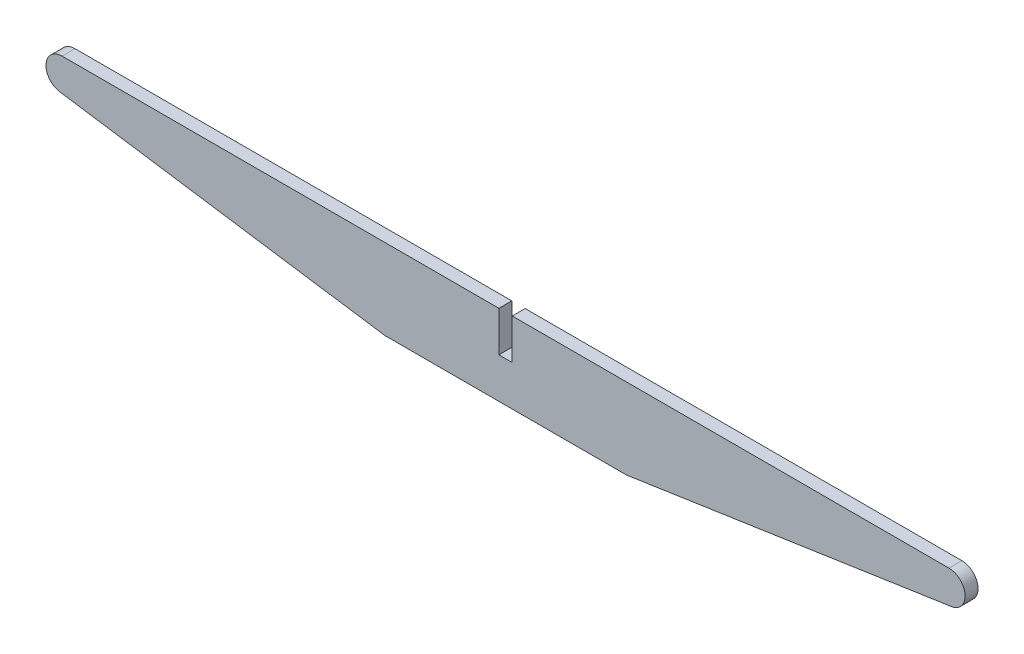
ISO-10303-21;
HEADER;
FILE_DESCRIPTION(('STEP AP214'),'2;1');
FILE_NAME('part.step','',(''),(''),'','','');
FILE_SCHEMA(('AUTOMOTIVE_DESIGN { 1 0 10303 214 1 1 1 1 }'));
ENDSEC;
DATA;
#1=APPLICATION_CONTEXT('core data for automotive mechanical design processes');
#2=APPLICATION_PROTOCOL_DEFINITION('international standard','automotive_design',2000,#1);
#3=PRODUCT_CONTEXT('',#1,'mechanical');
#4=PRODUCT('Part','Part','',(#3));
#5=PRODUCT_RELATED_PRODUCT_CATEGORY('part','',(#4));
#6=PRODUCT_DEFINITION_FORMATION('','',#4);
#7=PRODUCT_DEFINITION_CONTEXT('part definition',#1,'design');
#8=PRODUCT_DEFINITION('design','',#6,#7);
#9=PRODUCT_DEFINITION_SHAPE('','',#8);
#10=(LENGTH_UNIT() NAMED_UNIT(*) SI_UNIT(.MILLI.,.METRE.));
#11=(NAMED_UNIT(*) PLANE_ANGLE_UNIT() SI_UNIT($,.RADIAN.));
#12=(NAMED_UNIT(*) SI_UNIT($,.STERADIAN.) SOLID_ANGLE_UNIT());
#13=UNCERTAINTY_MEASURE_WITH_UNIT(LENGTH_MEASURE(1.E-05),#10,'distance_accuracy_value','');
#14=(GEOMETRIC_REPRESENTATION_CONTEXT(3) GLOBAL_UNCERTAINTY_ASSIGNED_CONTEXT((#13)) GLOBAL_UNIT_ASSIGNED_CONTEXT((#10,
#11,#12)) REPRESENTATION_CONTEXT('',''));
#15=CARTESIAN_POINT('',(0.,0.,0.));
#16=DIRECTION('',(0.,0.,1.));
#17=DIRECTION('',(1.,0.,0.));
#18=AXIS2_PLACEMENT_3D('',#15,#16,#17);
#19=CARTESIAN_POINT('',(-110.,0.,1.6));
#20=DIRECTION('',(0.,-1.,0.));
#21=DIRECTION('',(1.,0.,0.));
#22=AXIS2_PLACEMENT_3D('',#19,#20,#21);
#23=PLANE('',#22);
#24=DIRECTION('',(0.,0.,1.));
#25=VECTOR('',#24,1.);
#26=CARTESIAN_POINT('',(1.65,0.,-1.601));
#27=LINE('',#26,#25);
#28=CARTESIAN_POINT('',(1.65,0.,-1.6));
#29=VERTEX_POINT('',#28);
#30=CARTESIAN_POINT('',(1.65,0.,1.6));
#31=VERTEX_POINT('',#30);
#32=EDGE_CURVE('E169',#29,#31,#27,.T.);
#33=ORIENTED_EDGE('',*,*,#32,.T.);
#34=DIRECTION('',(-1.,0.,0.));
#35=VECTOR('',#34,1.);
#36=CARTESIAN_POINT('',(-110.,0.,1.6));
#37=LINE('',#36,#35);
#38=CARTESIAN_POINT('',(110.,0.,1.6));
#39=VERTEX_POINT('',#38);
#40=EDGE_CURVE('E92',#39,#31,#37,.T.);
#41=ORIENTED_EDGE('',*,*,#40,.F.);
#42=DIRECTION('',(0.,0.,-1.));
#43=VECTOR('',#42,1.);
#44=CARTESIAN_POINT('',(110.,0.,1.6));
#45=LINE('',#44,#43);
#46=CARTESIAN_POINT('',(110.,0.,-1.6));
#47=VERTEX_POINT('',#46);
#48=EDGE_CURVE('E11',#39,#47,#45,.T.);
#49=ORIENTED_EDGE('',*,*,#48,.T.);
#50=DIRECTION('',(-1.,0.,0.));
#51=VECTOR('',#50,1.);
#52=CARTESIAN_POINT('',(-110.,0.,-1.6));
#53=LINE('',#52,#51);
#54=EDGE_CURVE('E136',#47,#29,#53,.T.);
#55=ORIENTED_EDGE('',*,*,#54,.T.);
#56=EDGE_LOOP('',(#33,#41,#49,#55));
#57=FACE_BOUND('',#56,.T.);
#58=ADVANCED_FACE('F33',(#57),#23,.F.);
#59=CARTESIAN_POINT('',(110.,-4.,1.6));
#60=DIRECTION('',(0.,0.,-1.));
#61=DIRECTION('',(-1.,0.,0.));
#62=AXIS2_PLACEMENT_3D('',#59,#60,#61);
#63=PLANE('',#62);
#64=DIRECTION('',(0.,-1.,0.));
#65=VECTOR('',#64,1.);
#66=CARTESIAN_POINT('',(1.65,0.,1.6));
#67=LINE('',#66,#65);
#68=CARTESIAN_POINT('',(1.65,-10.,1.6));
#69=VERTEX_POINT('',#68);
#70=EDGE_CURVE('E175',#31,#69,#67,.T.);
#71=ORIENTED_EDGE('',*,*,#70,.T.);
#72=DIRECTION('',(1.,0.,0.));
#73=VECTOR('',#72,1.);
#74=CARTESIAN_POINT('',(0.,-10.,1.6));
#75=LINE('',#74,#73);
#76=CARTESIAN_POINT('',(-1.65,-10.,1.6));
#77=VERTEX_POINT('',#76);
#78=EDGE_CURVE('E201',#77,#69,#75,.T.);
#79=ORIENTED_EDGE('',*,*,#78,.F.);
#80=DIRECTION('',(0.,-1.,0.));
#81=VECTOR('',#80,1.);
#82=CARTESIAN_POINT('',(-1.65,0.,1.6));
#83=LINE('',#82,#81);
#84=CARTESIAN_POINT('',(-1.65,0.,1.6));
#85=VERTEX_POINT('',#84);
#86=EDGE_CURVE('E205',#85,#77,#83,.T.);
#87=ORIENTED_EDGE('',*,*,#86,.F.);
#88=CARTESIAN_POINT('',(-110.,0.,1.6));
#89=VERTEX_POINT('',#88);
#90=EDGE_CURVE('E165',#85,#89,#37,.T.);
#91=ORIENTED_EDGE('',*,*,#90,.T.);
#92=CARTESIAN_POINT('',(-110.,-4.00000000000003,1.6));
#93=DIRECTION('',(0.,0.,1.));
#94=DIRECTION('',(1.,0.,0.));
#95=AXIS2_PLACEMENT_3D('',#92,#93,#94);
#96=CIRCLE('',#95,4.00000000000001);
#97=CARTESIAN_POINT('',(-110.591213414902,-7.95606707451222,1.6));
#98=VERTEX_POINT('',#97);
#99=EDGE_CURVE('E110',#89,#98,#96,.T.);
#100=ORIENTED_EDGE('',*,*,#99,.T.);
#101=DIRECTION('',(0.989016768628046,-0.147803353725609,0.));
#102=VECTOR('',#101,1.);
#103=CARTESIAN_POINT('',(-110.591213414902,-7.95606707451221,1.6));
#104=LINE('',#103,#102);
#105=CARTESIAN_POINT('',(-30.,-20.,1.6));
#106=VERTEX_POINT('',#105);
#107=EDGE_CURVE('E102',#98,#106,#104,.T.);
#108=ORIENTED_EDGE('',*,*,#107,.T.);
#109=DIRECTION('',(1.,0.,0.));
#110=VECTOR('',#109,1.);
#111=CARTESIAN_POINT('',(-30.,-20.,1.6));
#112=LINE('',#111,#110);
#113=CARTESIAN_POINT('',(30.,-20.,1.6));
#114=VERTEX_POINT('',#113);
#115=EDGE_CURVE('E107',#106,#114,#112,.T.);
#116=ORIENTED_EDGE('',*,*,#115,.T.);
#117=DIRECTION('',(0.989016768628046,0.147803353725609,0.));
#118=VECTOR('',#117,1.);
#119=CARTESIAN_POINT('',(110.591213414902,-7.95606707451218,1.6));
#120=LINE('',#119,#118);
#121=CARTESIAN_POINT('',(110.591213414902,-7.95606707451218,1.6));
#122=VERTEX_POINT('',#121);
#123=EDGE_CURVE('E57',#114,#122,#120,.T.);
#124=ORIENTED_EDGE('',*,*,#123,.T.);
#125=CARTESIAN_POINT('',(110.,-4.,1.6));
#126=DIRECTION('',(0.,0.,1.));
#127=DIRECTION('',(-1.,0.,0.));
#128=AXIS2_PLACEMENT_3D('',#125,#126,#127);
#129=CIRCLE('',#128,4.00000000000001);
#130=EDGE_CURVE('E145',#122,#39,#129,.T.);
#131=ORIENTED_EDGE('',*,*,#130,.T.);
#132=ORIENTED_EDGE('',*,*,#40,.T.);
#133=EDGE_LOOP('',(#71,#79,#87,#91,#100,#108,#116,#124,#131,#132));
#134=FACE_BOUND('',#133,.T.);
#135=ADVANCED_FACE('F105',(#134),#63,.F.);
#136=CARTESIAN_POINT('',(110.,-4.,-1.6));
#137=DIRECTION('',(0.,0.,-1.));
#138=DIRECTION('',(-1.,0.,0.));
#139=AXIS2_PLACEMENT_3D('',#136,#137,#138);
#140=PLANE('',#139);
#141=DIRECTION('',(1.,0.,0.));
#142=VECTOR('',#141,1.);
#143=CARTESIAN_POINT('',(0.,-10.,-1.6));
#144=LINE('',#143,#142);
#145=CARTESIAN_POINT('',(-1.65,-10.,-1.6));
#146=VERTEX_POINT('',#145);
#147=CARTESIAN_POINT('',(1.65,-10.,-1.6));
#148=VERTEX_POINT('',#147);
#149=EDGE_CURVE('E197',#146,#148,#144,.T.);
#150=ORIENTED_EDGE('',*,*,#149,.T.);
#151=DIRECTION('',(0.,-1.,0.));
#152=VECTOR('',#151,1.);
#153=CARTESIAN_POINT('',(1.65,0.,-1.6));
#154=LINE('',#153,#152);
#155=EDGE_CURVE('E208',#29,#148,#154,.T.);
#156=ORIENTED_EDGE('',*,*,#155,.F.);
#157=ORIENTED_EDGE('',*,*,#54,.F.);
#158=CARTESIAN_POINT('',(110.,-4.,-1.6));
#159=DIRECTION('',(0.,0.,1.));
#160=DIRECTION('',(-1.,0.,0.));
#161=AXIS2_PLACEMENT_3D('',#158,#159,#160);
#162=CIRCLE('',#161,4.00000000000001);
#163=CARTESIAN_POINT('',(110.591213414902,-7.95606707451218,-1.6));
#164=VERTEX_POINT('',#163);
#165=EDGE_CURVE('E131',#164,#47,#162,.T.);
#166=ORIENTED_EDGE('',*,*,#165,.F.);
#167=DIRECTION('',(0.989016768628046,0.147803353725609,0.));
#168=VECTOR('',#167,1.);
#169=CARTESIAN_POINT('',(110.591213414902,-7.95606707451218,-1.6));
#170=LINE('',#169,#168);
#171=CARTESIAN_POINT('',(30.,-20.,-1.6));
#172=VERTEX_POINT('',#171);
#173=EDGE_CURVE('E84',#172,#164,#170,.T.);
#174=ORIENTED_EDGE('',*,*,#173,.F.);
#175=DIRECTION('',(1.,0.,0.));
#176=VECTOR('',#175,1.);
#177=CARTESIAN_POINT('',(30.,-20.,-1.6));
#178=LINE('',#177,#176);
#179=CARTESIAN_POINT('',(-30.,-20.,-1.6));
#180=VERTEX_POINT('',#179);
#181=EDGE_CURVE('E142',#180,#172,#178,.T.);
#182=ORIENTED_EDGE('',*,*,#181,.F.);
#183=DIRECTION('',(0.989016768628046,-0.147803353725609,0.));
#184=VECTOR('',#183,1.);
#185=CARTESIAN_POINT('',(-110.591213414902,-7.95606707451221,-1.6));
#186=LINE('',#185,#184);
#187=CARTESIAN_POINT('',(-110.591213414902,-7.95606707451222,-1.6));
#188=VERTEX_POINT('',#187);
#189=EDGE_CURVE('E120',#188,#180,#186,.T.);
#190=ORIENTED_EDGE('',*,*,#189,.F.);
#191=CARTESIAN_POINT('',(-110.,-4.00000000000003,-1.6));
#192=DIRECTION('',(0.,0.,1.));
#193=DIRECTION('',(1.,0.,0.));
#194=AXIS2_PLACEMENT_3D('',#191,#192,#193);
#195=CIRCLE('',#194,4.00000000000001);
#196=CARTESIAN_POINT('',(-110.,0.,-1.6));
#197=VERTEX_POINT('',#196);
#198=EDGE_CURVE('E139',#197,#188,#195,.T.);
#199=ORIENTED_EDGE('',*,*,#198,.F.);
#200=CARTESIAN_POINT('',(-1.65,0.,-1.6));
#201=VERTEX_POINT('',#200);
#202=EDGE_CURVE('E134',#201,#197,#53,.T.);
#203=ORIENTED_EDGE('',*,*,#202,.F.);
#204=DIRECTION('',(0.,-1.,0.));
#205=VECTOR('',#204,1.);
#206=CARTESIAN_POINT('',(-1.65,0.,-1.6));
#207=LINE('',#206,#205);
#208=EDGE_CURVE('E192',#201,#146,#207,.T.);
#209=ORIENTED_EDGE('',*,*,#208,.T.);
#210=EDGE_LOOP('',(#150,#156,#157,#166,#174,#182,#190,#199,#203,#209));
#211=FACE_BOUND('',#210,.T.);
#212=ADVANCED_FACE('F158',(#211),#140,.T.);
#213=CARTESIAN_POINT('',(110.,-4.,1.6));
#214=DIRECTION('',(0.,0.,-1.));
#215=DIRECTION('',(-1.,0.,0.));
#216=AXIS2_PLACEMENT_3D('',#213,#214,#215);
#217=CYLINDRICAL_SURFACE('',#216,4.00000000000001);
#218=ORIENTED_EDGE('',*,*,#165,.T.);
#219=ORIENTED_EDGE('',*,*,#48,.F.);
#220=ORIENTED_EDGE('',*,*,#130,.F.);
#221=DIRECTION('',(0.,0.,-1.));
#222=VECTOR('',#221,1.);
#223=CARTESIAN_POINT('',(110.591213414902,-7.95606707451218,1.6));
#224=LINE('',#223,#222);
#225=EDGE_CURVE('E127',#122,#164,#224,.T.);
#226=ORIENTED_EDGE('',*,*,#225,.T.);
#227=EDGE_LOOP('',(#218,#219,#220,#226));
#228=FACE_BOUND('',#227,.T.);
#229=ADVANCED_FACE('F35',(#228),#217,.T.);
#230=ORIENTED_EDGE('',*,*,#90,.F.);
#231=DIRECTION('',(0.,0.,1.));
#232=VECTOR('',#231,1.);
#233=CARTESIAN_POINT('',(-1.65,0.,-1.601));
#234=LINE('',#233,#232);
#235=EDGE_CURVE('E195',#201,#85,#234,.T.);
#236=ORIENTED_EDGE('',*,*,#235,.F.);
#237=ORIENTED_EDGE('',*,*,#202,.T.);
#238=DIRECTION('',(0.,0.,-1.));
#239=VECTOR('',#238,1.);
#240=CARTESIAN_POINT('',(-110.,0.,1.6));
#241=LINE('',#240,#239);
#242=EDGE_CURVE('E41',#89,#197,#241,.T.);
#243=ORIENTED_EDGE('',*,*,#242,.F.);
#244=EDGE_LOOP('',(#230,#236,#237,#243));
#245=FACE_BOUND('',#244,.T.);
#246=ADVANCED_FACE('F199',(#245),#23,.F.);
#247=CARTESIAN_POINT('',(-110.,-4.00000000000003,1.6));
#248=DIRECTION('',(0.,0.,-1.));
#249=DIRECTION('',(-1.,0.,0.));
#250=AXIS2_PLACEMENT_3D('',#247,#248,#249);
#251=CYLINDRICAL_SURFACE('',#250,4.00000000000001);
#252=ORIENTED_EDGE('',*,*,#198,.T.);
#253=DIRECTION('',(0.,0.,-1.));
#254=VECTOR('',#253,1.);
#255=CARTESIAN_POINT('',(-110.591213414902,-7.95606707451222,1.6));
#256=LINE('',#255,#254);
#257=EDGE_CURVE('E122',#98,#188,#256,.T.);
#258=ORIENTED_EDGE('',*,*,#257,.F.);
#259=ORIENTED_EDGE('',*,*,#99,.F.);
#260=ORIENTED_EDGE('',*,*,#242,.T.);
#261=EDGE_LOOP('',(#252,#258,#259,#260));
#262=FACE_BOUND('',#261,.T.);
#263=ADVANCED_FACE('F152',(#262),#251,.T.);
#264=CARTESIAN_POINT('',(-110.591213414902,-7.95606707451221,1.6));
#265=DIRECTION('',(0.147803353725609,0.989016768628046,0.));
#266=DIRECTION('',(-0.989016768628046,0.147803353725609,0.));
#267=AXIS2_PLACEMENT_3D('',#264,#265,#266);
#268=PLANE('',#267);
#269=ORIENTED_EDGE('',*,*,#189,.T.);
#270=DIRECTION('',(0.,0.,-1.));
#271=VECTOR('',#270,1.);
#272=CARTESIAN_POINT('',(-30.,-20.,1.6));
#273=LINE('',#272,#271);
#274=EDGE_CURVE('E117',#106,#180,#273,.T.);
#275=ORIENTED_EDGE('',*,*,#274,.F.);
#276=ORIENTED_EDGE('',*,*,#107,.F.);
#277=ORIENTED_EDGE('',*,*,#257,.T.);
#278=EDGE_LOOP('',(#269,#275,#276,#277));
#279=FACE_BOUND('',#278,.T.);
#280=ADVANCED_FACE('F118',(#279),#268,.F.);
#281=CARTESIAN_POINT('',(30.,-20.,1.6));
#282=DIRECTION('',(0.,1.,0.));
#283=DIRECTION('',(-1.,0.,0.));
#284=AXIS2_PLACEMENT_3D('',#281,#282,#283);
#285=PLANE('',#284);
#286=ORIENTED_EDGE('',*,*,#181,.T.);
#287=DIRECTION('',(0.,0.,-1.));
#288=VECTOR('',#287,1.);
#289=CARTESIAN_POINT('',(30.,-20.,1.6));
#290=LINE('',#289,#288);
#291=EDGE_CURVE('E123',#114,#172,#290,.T.);
#292=ORIENTED_EDGE('',*,*,#291,.F.);
#293=ORIENTED_EDGE('',*,*,#115,.F.);
#294=ORIENTED_EDGE('',*,*,#274,.T.);
#295=EDGE_LOOP('',(#286,#292,#293,#294));
#296=FACE_BOUND('',#295,.T.);
#297=ADVANCED_FACE('F125',(#296),#285,.F.);
#298=CARTESIAN_POINT('',(110.591213414902,-7.95606707451218,1.6));
#299=DIRECTION('',(-0.147803353725609,0.989016768628046,0.));
#300=DIRECTION('',(-0.989016768628046,-0.147803353725609,0.));
#301=AXIS2_PLACEMENT_3D('',#298,#299,#300);
#302=PLANE('',#301);
#303=ORIENTED_EDGE('',*,*,#173,.T.);
#304=ORIENTED_EDGE('',*,*,#225,.F.);
#305=ORIENTED_EDGE('',*,*,#123,.F.);
#306=ORIENTED_EDGE('',*,*,#291,.T.);
#307=EDGE_LOOP('',(#303,#304,#305,#306));
#308=FACE_BOUND('',#307,.T.);
#309=ADVANCED_FACE('F161',(#308),#302,.F.);
#310=CARTESIAN_POINT('',(1.65,0.,-1.601));
#311=DIRECTION('',(-1.,0.,0.));
#312=DIRECTION('',(0.,-1.,0.));
#313=AXIS2_PLACEMENT_3D('',#310,#311,#312);
#314=PLANE('',#313);
#315=ORIENTED_EDGE('',*,*,#155,.T.);
#316=DIRECTION('',(0.,0.,1.));
#317=VECTOR('',#316,1.);
#318=CARTESIAN_POINT('',(1.65,-10.,-1.601));
#319=LINE('',#318,#317);
#320=EDGE_CURVE('E135',#148,#69,#319,.T.);
#321=ORIENTED_EDGE('',*,*,#320,.T.);
#322=ORIENTED_EDGE('',*,*,#70,.F.);
#323=ORIENTED_EDGE('',*,*,#32,.F.);
#324=EDGE_LOOP('',(#315,#321,#322,#323));
#325=FACE_BOUND('',#324,.T.);
#326=ADVANCED_FACE('F214',(#325),#314,.T.);
#327=CARTESIAN_POINT('',(0.,-10.,-1.601));
#328=DIRECTION('',(0.,-1.,0.));
#329=DIRECTION('',(0.,0.,-1.));
#330=AXIS2_PLACEMENT_3D('',#327,#328,#329);
#331=PLANE('',#330);
#332=DIRECTION('',(0.,0.,1.));
#333=VECTOR('',#332,1.);
#334=CARTESIAN_POINT('',(-1.65,-10.,-1.601));
#335=LINE('',#334,#333);
#336=EDGE_CURVE('E48',#146,#77,#335,.T.);
#337=ORIENTED_EDGE('',*,*,#336,.T.);
#338=ORIENTED_EDGE('',*,*,#78,.T.);
#339=ORIENTED_EDGE('',*,*,#320,.F.);
#340=ORIENTED_EDGE('',*,*,#149,.F.);
#341=EDGE_LOOP('',(#337,#338,#339,#340));
#342=FACE_BOUND('',#341,.T.);
#343=ADVANCED_FACE('F212',(#342),#331,.F.);
#344=CARTESIAN_POINT('',(-1.65,0.,-1.601));
#345=DIRECTION('',(-1.,0.,0.));
#346=DIRECTION('',(0.,0.,1.));
#347=AXIS2_PLACEMENT_3D('',#344,#345,#346);
#348=PLANE('',#347);
#349=ORIENTED_EDGE('',*,*,#235,.T.);
#350=ORIENTED_EDGE('',*,*,#86,.T.);
#351=ORIENTED_EDGE('',*,*,#336,.F.);
#352=ORIENTED_EDGE('',*,*,#208,.F.);
#353=EDGE_LOOP('',(#349,#350,#351,#352));
#354=FACE_BOUND('',#353,.T.);
#355=ADVANCED_FACE('F194',(#354),#348,.F.);
#356=CLOSED_SHELL('',(#58,#135,#212,#229,#246,#263,#280,#297,#309,#326,#343,#355));
#357=MANIFOLD_SOLID_BREP('B2',#356);
#358=ADVANCED_BREP_SHAPE_REPRESENTATION('',(#18,#357),#14);
#359=SHAPE_DEFINITION_REPRESENTATION(#9,#358);
ENDSEC;
END-ISO-10303-21;
